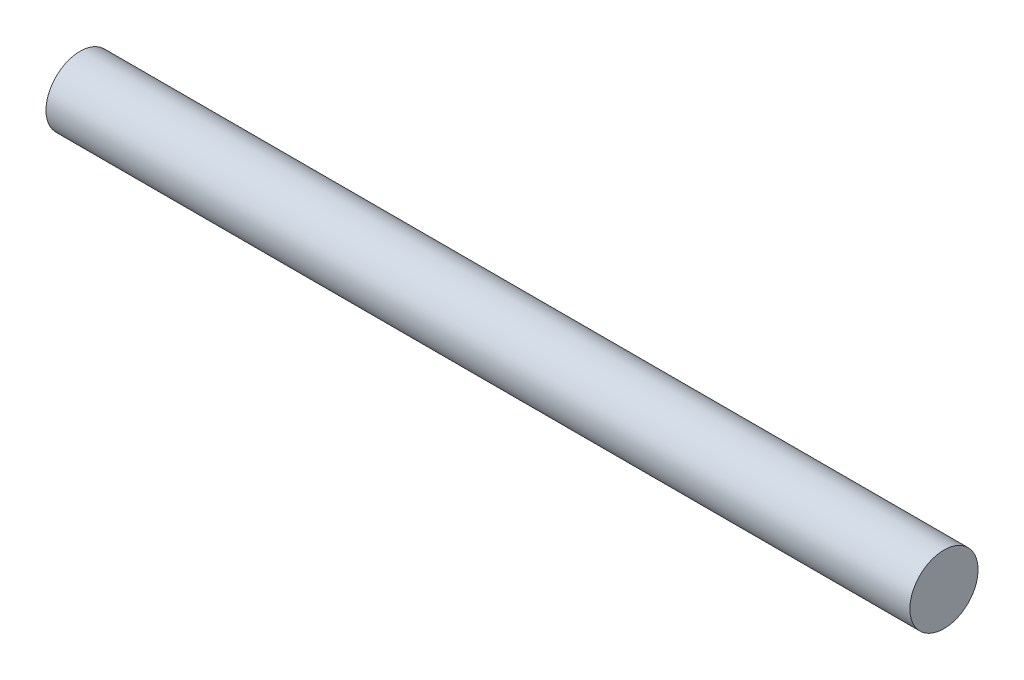
ISO-10303-21;
HEADER;
FILE_DESCRIPTION(('STEP AP214'),'2;1');
FILE_NAME('part.step','',(''),(''),'','','');
FILE_SCHEMA(('AUTOMOTIVE_DESIGN { 1 0 10303 214 1 1 1 1 }'));
ENDSEC;
DATA;
#1=APPLICATION_CONTEXT('core data for automotive mechanical design processes');
#2=APPLICATION_PROTOCOL_DEFINITION('international standard','automotive_design',2000,#1);
#3=PRODUCT_CONTEXT('',#1,'mechanical');
#4=PRODUCT('Part','Part','',(#3));
#5=PRODUCT_RELATED_PRODUCT_CATEGORY('part','',(#4));
#6=PRODUCT_DEFINITION_FORMATION('','',#4);
#7=PRODUCT_DEFINITION_CONTEXT('part definition',#1,'design');
#8=PRODUCT_DEFINITION('design','',#6,#7);
#9=PRODUCT_DEFINITION_SHAPE('','',#8);
#10=(LENGTH_UNIT() NAMED_UNIT(*) SI_UNIT(.MILLI.,.METRE.));
#11=(NAMED_UNIT(*) PLANE_ANGLE_UNIT() SI_UNIT($,.RADIAN.));
#12=(NAMED_UNIT(*) SI_UNIT($,.STERADIAN.) SOLID_ANGLE_UNIT());
#13=UNCERTAINTY_MEASURE_WITH_UNIT(LENGTH_MEASURE(1.E-05),#10,'distance_accuracy_value','');
#14=(GEOMETRIC_REPRESENTATION_CONTEXT(3) GLOBAL_UNCERTAINTY_ASSIGNED_CONTEXT((#13)) GLOBAL_UNIT_ASSIGNED_CONTEXT((#10,
#11,#12)) REPRESENTATION_CONTEXT('',''));
#15=CARTESIAN_POINT('',(0.,0.,0.));
#16=DIRECTION('',(0.,0.,1.));
#17=DIRECTION('',(1.,0.,0.));
#18=AXIS2_PLACEMENT_3D('',#15,#16,#17);
#19=CARTESIAN_POINT('',(120.65,0.,0.));
#20=DIRECTION('',(-1.,0.,0.));
#21=DIRECTION('',(0.,0.,1.));
#22=AXIS2_PLACEMENT_3D('',#19,#20,#21);
#23=CYLINDRICAL_SURFACE('',#22,4.7625);
#24=CARTESIAN_POINT('',(120.65,0.,0.));
#25=DIRECTION('',(1.,0.,0.));
#26=DIRECTION('',(0.,0.,-1.));
#27=AXIS2_PLACEMENT_3D('',#24,#25,#26);
#28=CIRCLE('',#27,4.7625);
#29=CARTESIAN_POINT('',(120.65,0.,4.7625));
#30=VERTEX_POINT('',#29);
#31=EDGE_CURVE('E10',#30,#30,#28,.T.);
#32=CARTESIAN_POINT('',(0.,0.,0.));
#33=DIRECTION('',(1.,0.,0.));
#34=DIRECTION('',(0.,0.,-1.));
#35=AXIS2_PLACEMENT_3D('',#32,#33,#34);
#36=CIRCLE('',#35,4.7625);
#37=CARTESIAN_POINT('',(0.,0.,4.7625));
#38=VERTEX_POINT('',#37);
#39=EDGE_CURVE('E33',#38,#38,#36,.T.);
#40=CARTESIAN_POINT('',(120.65,0.,4.7625));
#41=CARTESIAN_POINT('',(119.393229166667,0.,4.7625));
#42=CARTESIAN_POINT('',(118.136458333333,0.,4.7625));
#43=CARTESIAN_POINT('',(115.622916666667,0.,4.7625));
#44=CARTESIAN_POINT('',(114.366145833333,0.,4.7625));
#45=CARTESIAN_POINT('',(111.852604166667,0.,4.7625));
#46=CARTESIAN_POINT('',(110.595833333333,0.,4.7625));
#47=CARTESIAN_POINT('',(108.082291666667,0.,4.7625));
#48=CARTESIAN_POINT('',(106.825520833333,0.,4.7625));
#49=CARTESIAN_POINT('',(104.311979166667,0.,4.7625));
#50=CARTESIAN_POINT('',(103.055208333333,0.,4.7625));
#51=CARTESIAN_POINT('',(100.541666666667,0.,4.7625));
#52=CARTESIAN_POINT('',(99.2848958333333,0.,4.7625));
#53=CARTESIAN_POINT('',(96.7713541666667,0.,4.7625));
#54=CARTESIAN_POINT('',(95.5145833333333,0.,4.7625));
#55=CARTESIAN_POINT('',(93.0010416666667,0.,4.7625));
#56=CARTESIAN_POINT('',(91.7442708333333,0.,4.7625));
#57=CARTESIAN_POINT('',(89.2307291666667,0.,4.7625));
#58=CARTESIAN_POINT('',(87.9739583333333,0.,4.7625));
#59=CARTESIAN_POINT('',(85.4604166666667,0.,4.7625));
#60=CARTESIAN_POINT('',(84.2036458333333,0.,4.7625));
#61=CARTESIAN_POINT('',(81.6901041666667,0.,4.7625));
#62=CARTESIAN_POINT('',(80.4333333333333,0.,4.7625));
#63=CARTESIAN_POINT('',(77.9197916666667,0.,4.7625));
#64=CARTESIAN_POINT('',(76.6630208333333,0.,4.7625));
#65=CARTESIAN_POINT('',(74.1494791666667,0.,4.7625));
#66=CARTESIAN_POINT('',(72.8927083333333,0.,4.7625));
#67=CARTESIAN_POINT('',(70.3791666666667,0.,4.7625));
#68=CARTESIAN_POINT('',(69.1223958333333,0.,4.7625));
#69=CARTESIAN_POINT('',(66.6088541666667,0.,4.7625));
#70=CARTESIAN_POINT('',(65.3520833333333,0.,4.7625));
#71=CARTESIAN_POINT('',(62.8385416666667,0.,4.7625));
#72=CARTESIAN_POINT('',(61.5817708333333,0.,4.7625));
#73=CARTESIAN_POINT('',(59.0682291666667,0.,4.7625));
#74=CARTESIAN_POINT('',(57.8114583333333,0.,4.7625));
#75=CARTESIAN_POINT('',(55.2979166666667,0.,4.7625));
#76=CARTESIAN_POINT('',(54.0411458333333,0.,4.7625));
#77=CARTESIAN_POINT('',(51.5276041666667,0.,4.7625));
#78=CARTESIAN_POINT('',(50.2708333333333,0.,4.7625));
#79=CARTESIAN_POINT('',(47.7572916666667,0.,4.7625));
#80=CARTESIAN_POINT('',(46.5005208333333,0.,4.7625));
#81=CARTESIAN_POINT('',(43.9869791666667,0.,4.7625));
#82=CARTESIAN_POINT('',(42.7302083333333,0.,4.7625));
#83=CARTESIAN_POINT('',(40.2166666666667,0.,4.7625));
#84=CARTESIAN_POINT('',(38.9598958333333,0.,4.7625));
#85=CARTESIAN_POINT('',(36.4463541666667,0.,4.7625));
#86=CARTESIAN_POINT('',(35.1895833333333,0.,4.7625));
#87=CARTESIAN_POINT('',(32.6760416666667,0.,4.7625));
#88=CARTESIAN_POINT('',(31.4192708333333,0.,4.7625));
#89=CARTESIAN_POINT('',(28.9057291666667,0.,4.7625));
#90=CARTESIAN_POINT('',(27.6489583333333,0.,4.7625));
#91=CARTESIAN_POINT('',(25.1354166666667,0.,4.7625));
#92=CARTESIAN_POINT('',(23.8786458333333,0.,4.7625));
#93=CARTESIAN_POINT('',(21.3651041666667,0.,4.7625));
#94=CARTESIAN_POINT('',(20.1083333333333,0.,4.7625));
#95=CARTESIAN_POINT('',(17.5947916666667,0.,4.7625));
#96=CARTESIAN_POINT('',(16.3380208333333,0.,4.7625));
#97=CARTESIAN_POINT('',(13.8244791666667,0.,4.7625));
#98=CARTESIAN_POINT('',(12.5677083333333,0.,4.7625));
#99=CARTESIAN_POINT('',(10.0541666666667,0.,4.7625));
#100=CARTESIAN_POINT('',(8.79739583333333,0.,4.7625));
#101=CARTESIAN_POINT('',(6.28385416666666,0.,4.7625));
#102=CARTESIAN_POINT('',(5.02708333333333,0.,4.7625));
#103=CARTESIAN_POINT('',(2.51354166666667,0.,4.7625));
#104=CARTESIAN_POINT('',(1.25677083333333,0.,4.7625));
#105=CARTESIAN_POINT('',(0.,0.,4.7625));
#106=B_SPLINE_CURVE_WITH_KNOTS('',3,(#40,#41,#42,#43,#44,#45,#46,#47,#48,#49,#50,#51,#52,#53,
#54,#55,#56,#57,#58,#59,#60,#61,#62,#63,#64,#65,#66,#67,#68,#69,#70,#71,#72,#73,#74,#75,#76,#77,
#78,#79,#80,#81,#82,#83,#84,#85,#86,#87,#88,#89,#90,#91,#92,#93,#94,#95,#96,#97,#98,#99,#100,
#101,#102,#103,#104,#105),.UNSPECIFIED.,.F.,.F.,(4,2,2,2,2,2,2,2,2,2,2,2,2,2,2,2,2,2,2,2,2,2,2,
2,2,2,2,2,2,2,2,2,4),(0.,3.7703125,7.540625,11.3109375,15.08125,18.8515625,22.621875,26.3921875,
30.1625,33.9328125,37.703125,41.4734375,45.24375,49.0140625,52.784375,56.5546875,60.325,
64.0953125,67.865625,71.6359375,75.40625,79.1765625,82.946875,86.7171875,90.4875,94.2578125,
98.028125,101.7984375,105.56875,109.3390625,113.109375,116.8796875,120.65),.UNSPECIFIED.);
#107=EDGE_CURVE('BSEAM30',#30,#38,#106,.T.);
#108=ORIENTED_EDGE('',*,*,#31,.F.);
#109=ORIENTED_EDGE('',*,*,#39,.T.);
#110=ORIENTED_EDGE('',*,*,#107,.T.);
#111=ORIENTED_EDGE('',*,*,#107,.F.);
#112=EDGE_LOOP('',(#108,#110,#109,#111));
#113=FACE_BOUND('',#112,.T.);
#114=ADVANCED_FACE('F30',(#113),#23,.T.);
#115=CARTESIAN_POINT('',(120.65,0.,0.));
#116=DIRECTION('',(1.,0.,0.));
#117=DIRECTION('',(0.,0.,-1.));
#118=AXIS2_PLACEMENT_3D('',#115,#116,#117);
#119=PLANE('',#118);
#120=ORIENTED_EDGE('',*,*,#31,.T.);
#121=EDGE_LOOP('',(#120));
#122=FACE_BOUND('',#121,.T.);
#123=ADVANCED_FACE('F45',(#122),#119,.T.);
#124=CARTESIAN_POINT('',(0.,0.,0.));
#125=DIRECTION('',(1.,0.,0.));
#126=DIRECTION('',(0.,0.,-1.));
#127=AXIS2_PLACEMENT_3D('',#124,#125,#126);
#128=PLANE('',#127);
#129=ORIENTED_EDGE('',*,*,#39,.F.);
#130=EDGE_LOOP('',(#129));
#131=FACE_BOUND('',#130,.T.);
#132=ADVANCED_FACE('F43',(#131),#128,.F.);
#133=CLOSED_SHELL('',(#114,#123,#132));
#134=MANIFOLD_SOLID_BREP('B2',#133);
#135=ADVANCED_BREP_SHAPE_REPRESENTATION('',(#18,#134),#14);
#136=SHAPE_DEFINITION_REPRESENTATION(#9,#135);
ENDSEC;
END-ISO-10303-21;
